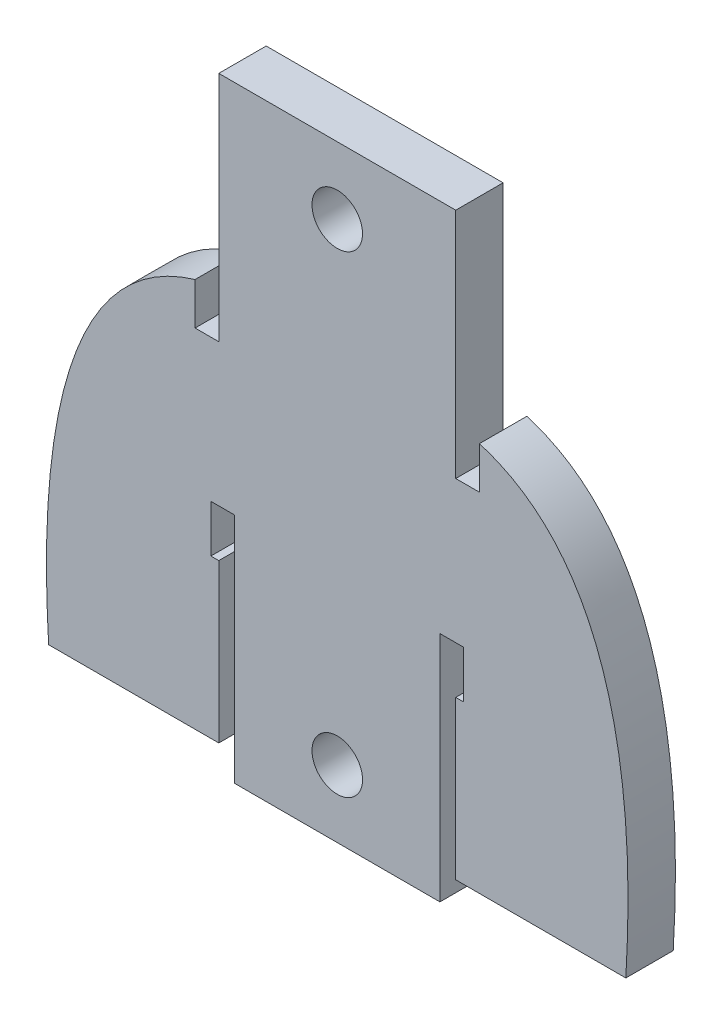
ISO-10303-21;
HEADER;
FILE_DESCRIPTION(('STEP AP214'),'2;1');
FILE_NAME('part.step','',(''),(''),'','','');
FILE_SCHEMA(('AUTOMOTIVE_DESIGN { 1 0 10303 214 1 1 1 1 }'));
ENDSEC;
DATA;
#1=APPLICATION_CONTEXT('core data for automotive mechanical design processes');
#2=APPLICATION_PROTOCOL_DEFINITION('international standard','automotive_design',2000,#1);
#3=PRODUCT_CONTEXT('',#1,'mechanical');
#4=PRODUCT('Part','Part','',(#3));
#5=PRODUCT_RELATED_PRODUCT_CATEGORY('part','',(#4));
#6=PRODUCT_DEFINITION_FORMATION('','',#4);
#7=PRODUCT_DEFINITION_CONTEXT('part definition',#1,'design');
#8=PRODUCT_DEFINITION('design','',#6,#7);
#9=PRODUCT_DEFINITION_SHAPE('','',#8);
#10=(LENGTH_UNIT() NAMED_UNIT(*) SI_UNIT(.MILLI.,.METRE.));
#11=(NAMED_UNIT(*) PLANE_ANGLE_UNIT() SI_UNIT($,.RADIAN.));
#12=(NAMED_UNIT(*) SI_UNIT($,.STERADIAN.) SOLID_ANGLE_UNIT());
#13=UNCERTAINTY_MEASURE_WITH_UNIT(LENGTH_MEASURE(1.E-05),#10,'distance_accuracy_value','');
#14=(GEOMETRIC_REPRESENTATION_CONTEXT(3) GLOBAL_UNCERTAINTY_ASSIGNED_CONTEXT((#13)) GLOBAL_UNIT_ASSIGNED_CONTEXT((#10,
#11,#12)) REPRESENTATION_CONTEXT('',''));
#15=CARTESIAN_POINT('',(0.,0.,0.));
#16=DIRECTION('',(0.,0.,1.));
#17=DIRECTION('',(1.,0.,0.));
#18=AXIS2_PLACEMENT_3D('',#15,#16,#17);
#19=CARTESIAN_POINT('',(24.726999090185,4.8045723425981,-3.));
#20=DIRECTION('',(0.,0.,-1.));
#21=DIRECTION('',(-1.,0.,0.));
#22=AXIS2_PLACEMENT_3D('',#19,#20,#21);
#23=PLANE('',#22);
#24=DIRECTION('',(0.,1.,0.));
#25=VECTOR('',#24,1.);
#26=CARTESIAN_POINT('',(-0.5,0.,-3.));
#27=LINE('',#26,#25);
#28=CARTESIAN_POINT('',(-0.5,0.,-3.));
#29=VERTEX_POINT('',#28);
#30=CARTESIAN_POINT('',(-0.5,3.,-3.));
#31=VERTEX_POINT('',#30);
#32=EDGE_CURVE('E56',#29,#31,#27,.T.);
#33=ORIENTED_EDGE('',*,*,#32,.F.);
#34=DIRECTION('',(-1.,0.,0.));
#35=VECTOR('',#34,1.);
#36=CARTESIAN_POINT('',(0.999999999999997,0.,-3.));
#37=LINE('',#36,#35);
#38=CARTESIAN_POINT('',(0.,0.,-3.));
#39=VERTEX_POINT('',#38);
#40=EDGE_CURVE('E236',#39,#29,#37,.T.);
#41=ORIENTED_EDGE('',*,*,#40,.F.);
#42=DIRECTION('',(0.,1.,0.));
#43=VECTOR('',#42,1.);
#44=CARTESIAN_POINT('',(0.,-10.,-3.));
#45=LINE('',#44,#43);
#46=CARTESIAN_POINT('',(0.,-10.,-3.));
#47=VERTEX_POINT('',#46);
#48=EDGE_CURVE('E395',#47,#39,#45,.T.);
#49=ORIENTED_EDGE('',*,*,#48,.F.);
#50=DIRECTION('',(1.,0.,0.));
#51=VECTOR('',#50,1.);
#52=CARTESIAN_POINT('',(0.,-10.,-3.));
#53=LINE('',#52,#51);
#54=CARTESIAN_POINT('',(-10.769213986079,-10.,-3.));
#55=VERTEX_POINT('',#54);
#56=EDGE_CURVE('E433',#55,#47,#53,.T.);
#57=ORIENTED_EDGE('',*,*,#56,.F.);
#58=CARTESIAN_POINT('',(0.,15.,-3.));
#59=CARTESIAN_POINT('',(-11.1028341379482,13.2297666244831,-3.));
#60=CARTESIAN_POINT('',(-11.2460921071856,-2.08424037755486,-3.));
#61=CARTESIAN_POINT('',(-10.769213986079,-10.,-3.));
#62=B_SPLINE_CURVE_WITH_KNOTS('',3,(#58,#59,#60,#61),.UNSPECIFIED.,.F.,.F.,(4,4),(0.,1.),.UNSPECIFIED.);
#63=CARTESIAN_POINT('',(-1.50000001798802,14.6610170054647,-3.));
#64=VERTEX_POINT('',#63);
#65=EDGE_CURVE('E317',#64,#55,#62,.T.);
#66=ORIENTED_EDGE('',*,*,#65,.F.);
#67=DIRECTION('',(-3.37991384558532E-09,1.,0.));
#68=VECTOR('',#67,1.);
#69=CARTESIAN_POINT('',(-1.5,12.,-3.));
#70=LINE('',#69,#68);
#71=CARTESIAN_POINT('',(-1.5,12.,-3.));
#72=VERTEX_POINT('',#71);
#73=EDGE_CURVE('E290',#72,#64,#70,.T.);
#74=ORIENTED_EDGE('',*,*,#73,.F.);
#75=DIRECTION('',(-1.,0.,0.));
#76=VECTOR('',#75,1.);
#77=CARTESIAN_POINT('',(0.,12.,-3.));
#78=LINE('',#77,#76);
#79=CARTESIAN_POINT('',(0.,12.,-3.));
#80=VERTEX_POINT('',#79);
#81=EDGE_CURVE('E286',#80,#72,#78,.T.);
#82=ORIENTED_EDGE('',*,*,#81,.F.);
#83=DIRECTION('',(0.,-1.,0.));
#84=VECTOR('',#83,1.);
#85=CARTESIAN_POINT('',(0.,13.5,-3.));
#86=LINE('',#85,#84);
#87=CARTESIAN_POINT('',(0.,26.7123889803847,-2.99999999999994));
#88=VERTEX_POINT('',#87);
#89=EDGE_CURVE('E213',#88,#80,#86,.T.);
#90=ORIENTED_EDGE('',*,*,#89,.F.);
#91=DIRECTION('',(-1.,0.,0.));
#92=VECTOR('',#91,1.);
#93=CARTESIAN_POINT('',(0.,26.7123889803847,-2.99999999999994));
#94=LINE('',#93,#92);
#95=CARTESIAN_POINT('',(15.,26.7123889803847,-2.99999999999994));
#96=VERTEX_POINT('',#95);
#97=EDGE_CURVE('E205',#96,#88,#94,.T.);
#98=ORIENTED_EDGE('',*,*,#97,.F.);
#99=DIRECTION('',(0.,1.,0.));
#100=VECTOR('',#99,1.);
#101=CARTESIAN_POINT('',(15.,12.,-3.));
#102=LINE('',#101,#100);
#103=CARTESIAN_POINT('',(15.,12.,-3.));
#104=VERTEX_POINT('',#103);
#105=EDGE_CURVE('E189',#104,#96,#102,.T.);
#106=ORIENTED_EDGE('',*,*,#105,.F.);
#107=DIRECTION('',(-1.,0.,0.));
#108=VECTOR('',#107,1.);
#109=CARTESIAN_POINT('',(16.5,12.,-3.));
#110=LINE('',#109,#108);
#111=CARTESIAN_POINT('',(16.5,12.,-3.));
#112=VERTEX_POINT('',#111);
#113=EDGE_CURVE('E283',#112,#104,#110,.T.);
#114=ORIENTED_EDGE('',*,*,#113,.F.);
#115=DIRECTION('',(-3.37991596426825E-09,-1.,0.));
#116=VECTOR('',#115,1.);
#117=CARTESIAN_POINT('',(16.500000008994,14.6610170081404,-3.));
#118=LINE('',#117,#116);
#119=CARTESIAN_POINT('',(16.500000017988,14.6610170054647,-3.));
#120=VERTEX_POINT('',#119);
#121=EDGE_CURVE('E278',#120,#112,#118,.T.);
#122=ORIENTED_EDGE('',*,*,#121,.F.);
#123=CARTESIAN_POINT('',(25.769213986079,-10.,-3.));
#124=CARTESIAN_POINT('',(26.2460921071856,-2.08424037755486,-3.));
#125=CARTESIAN_POINT('',(26.1028341379482,13.2297666244831,-3.));
#126=CARTESIAN_POINT('',(15.,15.,-3.));
#127=B_SPLINE_CURVE_WITH_KNOTS('',3,(#123,#124,#125,#126),.UNSPECIFIED.,.F.,.F.,(4,4),(0.,1.),.UNSPECIFIED.);
#128=CARTESIAN_POINT('',(25.769213986079,-10.,-3.));
#129=VERTEX_POINT('',#128);
#130=EDGE_CURVE('E311',#129,#120,#127,.T.);
#131=ORIENTED_EDGE('',*,*,#130,.F.);
#132=DIRECTION('',(1.,0.,0.));
#133=VECTOR('',#132,1.);
#134=CARTESIAN_POINT('',(15.,-10.,-3.));
#135=LINE('',#134,#133);
#136=CARTESIAN_POINT('',(15.,-10.,-3.));
#137=VERTEX_POINT('',#136);
#138=EDGE_CURVE('E307',#137,#129,#135,.T.);
#139=ORIENTED_EDGE('',*,*,#138,.F.);
#140=DIRECTION('',(0.,-1.,0.));
#141=VECTOR('',#140,1.);
#142=CARTESIAN_POINT('',(15.,0.,-3.));
#143=LINE('',#142,#141);
#144=CARTESIAN_POINT('',(15.,0.,-3.));
#145=VERTEX_POINT('',#144);
#146=EDGE_CURVE('E304',#145,#137,#143,.T.);
#147=ORIENTED_EDGE('',*,*,#146,.F.);
#148=DIRECTION('',(-1.,0.,0.));
#149=VECTOR('',#148,1.);
#150=CARTESIAN_POINT('',(15.5,0.,-3.));
#151=LINE('',#150,#149);
#152=CARTESIAN_POINT('',(15.5,0.,-3.));
#153=VERTEX_POINT('',#152);
#154=EDGE_CURVE('E257',#153,#145,#151,.T.);
#155=ORIENTED_EDGE('',*,*,#154,.F.);
#156=DIRECTION('',(0.,-1.,0.));
#157=VECTOR('',#156,1.);
#158=CARTESIAN_POINT('',(15.5,3.,-3.));
#159=LINE('',#158,#157);
#160=CARTESIAN_POINT('',(15.5,3.,-3.));
#161=VERTEX_POINT('',#160);
#162=EDGE_CURVE('E253',#161,#153,#159,.T.);
#163=ORIENTED_EDGE('',*,*,#162,.F.);
#164=DIRECTION('',(1.,0.,0.));
#165=VECTOR('',#164,1.);
#166=CARTESIAN_POINT('',(14.,3.,-3.));
#167=LINE('',#166,#165);
#168=CARTESIAN_POINT('',(14.,3.,-3.));
#169=VERTEX_POINT('',#168);
#170=EDGE_CURVE('E249',#169,#161,#167,.T.);
#171=ORIENTED_EDGE('',*,*,#170,.F.);
#172=DIRECTION('',(0.,1.,0.));
#173=VECTOR('',#172,1.);
#174=CARTESIAN_POINT('',(14.,1.5,-3.));
#175=LINE('',#174,#173);
#176=CARTESIAN_POINT('',(14.,-11.7123889803847,-2.99999999999994));
#177=VERTEX_POINT('',#176);
#178=EDGE_CURVE('E246',#177,#169,#175,.T.);
#179=ORIENTED_EDGE('',*,*,#178,.F.);
#180=DIRECTION('',(1.,0.,0.));
#181=VECTOR('',#180,1.);
#182=CARTESIAN_POINT('',(14.,-11.7123889803847,-2.99999999999994));
#183=LINE('',#182,#181);
#184=CARTESIAN_POINT('',(1.,-11.7123889803847,-2.99999999999994));
#185=VERTEX_POINT('',#184);
#186=EDGE_CURVE('E233',#185,#177,#183,.T.);
#187=ORIENTED_EDGE('',*,*,#186,.F.);
#188=DIRECTION('',(0.,-1.,0.));
#189=VECTOR('',#188,1.);
#190=CARTESIAN_POINT('',(1.,3.,-3.));
#191=LINE('',#190,#189);
#192=CARTESIAN_POINT('',(1.,3.,-3.));
#193=VERTEX_POINT('',#192);
#194=EDGE_CURVE('E243',#193,#185,#191,.T.);
#195=ORIENTED_EDGE('',*,*,#194,.F.);
#196=DIRECTION('',(1.,0.,0.));
#197=VECTOR('',#196,1.);
#198=CARTESIAN_POINT('',(-0.5,3.,-3.));
#199=LINE('',#198,#197);
#200=EDGE_CURVE('E61',#31,#193,#199,.T.);
#201=ORIENTED_EDGE('',*,*,#200,.F.);
#202=EDGE_LOOP('',(#33,#41,#49,#57,#66,#74,#82,#90,#98,#106,#114,#122,#131,#139,#147,#155,#163,
#171,#179,#187,#195,#201));
#203=FACE_BOUND('',#202,.T.);
#204=CARTESIAN_POINT('',(7.5,-7.46238898038476,-2.99999999999997));
#205=DIRECTION('',(0.,0.,-1.));
#206=DIRECTION('',(0.,1.,0.));
#207=AXIS2_PLACEMENT_3D('',#204,#205,#206);
#208=CIRCLE('',#207,1.6);
#209=CARTESIAN_POINT('',(7.5,-5.86238898038476,-2.99999999999998));
#210=VERTEX_POINT('',#209);
#211=EDGE_CURVE('E227',#210,#210,#208,.T.);
#212=ORIENTED_EDGE('',*,*,#211,.F.);
#213=EDGE_LOOP('',(#212));
#214=FACE_BOUND('',#213,.T.);
#215=CARTESIAN_POINT('',(7.5,22.4623889803847,-2.99999999999997));
#216=DIRECTION('',(0.,0.,-1.));
#217=DIRECTION('',(0.,1.,0.));
#218=AXIS2_PLACEMENT_3D('',#215,#216,#217);
#219=CIRCLE('',#218,1.6);
#220=CARTESIAN_POINT('',(7.5,24.0623889803847,-2.99999999999996));
#221=VERTEX_POINT('',#220);
#222=EDGE_CURVE('E209',#221,#221,#219,.T.);
#223=ORIENTED_EDGE('',*,*,#222,.F.);
#224=EDGE_LOOP('',(#223));
#225=FACE_BOUND('',#224,.T.);
#226=ADVANCED_FACE('F41',(#203,#214,#225),#23,.T.);
#227=CARTESIAN_POINT('',(24.726999090185,4.8045723425981,0.));
#228=DIRECTION('',(0.,0.,-1.));
#229=DIRECTION('',(-1.,0.,0.));
#230=AXIS2_PLACEMENT_3D('',#227,#228,#229);
#231=PLANE('',#230);
#232=DIRECTION('',(1.,0.,0.));
#233=VECTOR('',#232,1.);
#234=CARTESIAN_POINT('',(24.726999090185,0.,0.));
#235=LINE('',#234,#233);
#236=CARTESIAN_POINT('',(-0.5,0.,0.));
#237=VERTEX_POINT('',#236);
#238=CARTESIAN_POINT('',(0.,0.,0.));
#239=VERTEX_POINT('',#238);
#240=EDGE_CURVE('E274',#237,#239,#235,.T.);
#241=ORIENTED_EDGE('',*,*,#240,.F.);
#242=DIRECTION('',(0.,-1.,0.));
#243=VECTOR('',#242,1.);
#244=CARTESIAN_POINT('',(-0.5,4.8045723425981,0.));
#245=LINE('',#244,#243);
#246=CARTESIAN_POINT('',(-0.5,3.,0.));
#247=VERTEX_POINT('',#246);
#248=EDGE_CURVE('E12',#247,#237,#245,.T.);
#249=ORIENTED_EDGE('',*,*,#248,.F.);
#250=DIRECTION('',(-1.,0.,0.));
#251=VECTOR('',#250,1.);
#252=CARTESIAN_POINT('',(24.726999090185,3.,0.));
#253=LINE('',#252,#251);
#254=CARTESIAN_POINT('',(1.,3.,0.));
#255=VERTEX_POINT('',#254);
#256=EDGE_CURVE('E49',#255,#247,#253,.T.);
#257=ORIENTED_EDGE('',*,*,#256,.F.);
#258=DIRECTION('',(0.,1.,0.));
#259=VECTOR('',#258,1.);
#260=CARTESIAN_POINT('',(1.,4.8045723425981,0.));
#261=LINE('',#260,#259);
#262=CARTESIAN_POINT('',(1.,-11.7123889803847,0.));
#263=VERTEX_POINT('',#262);
#264=EDGE_CURVE('E419',#263,#255,#261,.T.);
#265=ORIENTED_EDGE('',*,*,#264,.F.);
#266=DIRECTION('',(1.,0.,0.));
#267=VECTOR('',#266,1.);
#268=CARTESIAN_POINT('',(14.,-11.7123889803847,0.));
#269=LINE('',#268,#267);
#270=CARTESIAN_POINT('',(14.,-11.7123889803847,0.));
#271=VERTEX_POINT('',#270);
#272=EDGE_CURVE('E217',#263,#271,#269,.T.);
#273=ORIENTED_EDGE('',*,*,#272,.T.);
#274=DIRECTION('',(0.,-1.,0.));
#275=VECTOR('',#274,1.);
#276=CARTESIAN_POINT('',(14.,4.8045723425981,0.));
#277=LINE('',#276,#275);
#278=CARTESIAN_POINT('',(14.,3.,0.));
#279=VERTEX_POINT('',#278);
#280=EDGE_CURVE('E417',#279,#271,#277,.T.);
#281=ORIENTED_EDGE('',*,*,#280,.F.);
#282=DIRECTION('',(-1.,0.,0.));
#283=VECTOR('',#282,1.);
#284=CARTESIAN_POINT('',(24.726999090185,3.,0.));
#285=LINE('',#284,#283);
#286=CARTESIAN_POINT('',(15.5,3.,0.));
#287=VERTEX_POINT('',#286);
#288=EDGE_CURVE('E414',#287,#279,#285,.T.);
#289=ORIENTED_EDGE('',*,*,#288,.F.);
#290=DIRECTION('',(0.,1.,0.));
#291=VECTOR('',#290,1.);
#292=CARTESIAN_POINT('',(15.5,4.8045723425981,0.));
#293=LINE('',#292,#291);
#294=CARTESIAN_POINT('',(15.5,0.,0.));
#295=VERTEX_POINT('',#294);
#296=EDGE_CURVE('E411',#295,#287,#293,.T.);
#297=ORIENTED_EDGE('',*,*,#296,.F.);
#298=DIRECTION('',(1.,0.,0.));
#299=VECTOR('',#298,1.);
#300=CARTESIAN_POINT('',(24.726999090185,0.,0.));
#301=LINE('',#300,#299);
#302=CARTESIAN_POINT('',(15.,0.,0.));
#303=VERTEX_POINT('',#302);
#304=EDGE_CURVE('E238',#303,#295,#301,.T.);
#305=ORIENTED_EDGE('',*,*,#304,.F.);
#306=DIRECTION('',(0.,-1.,0.));
#307=VECTOR('',#306,1.);
#308=CARTESIAN_POINT('',(15.,0.,0.));
#309=LINE('',#308,#307);
#310=CARTESIAN_POINT('',(15.,-10.,0.));
#311=VERTEX_POINT('',#310);
#312=EDGE_CURVE('E281',#303,#311,#309,.T.);
#313=ORIENTED_EDGE('',*,*,#312,.T.);
#314=DIRECTION('',(1.,0.,0.));
#315=VECTOR('',#314,1.);
#316=CARTESIAN_POINT('',(15.,-10.,0.));
#317=LINE('',#316,#315);
#318=CARTESIAN_POINT('',(25.769213986079,-10.,0.));
#319=VERTEX_POINT('',#318);
#320=EDGE_CURVE('E438',#311,#319,#317,.T.);
#321=ORIENTED_EDGE('',*,*,#320,.T.);
#322=CARTESIAN_POINT('',(25.769213986079,-10.,0.));
#323=CARTESIAN_POINT('',(26.2460921071856,-2.08424037755486,0.));
#324=CARTESIAN_POINT('',(26.1028341379482,13.2297666244831,0.));
#325=CARTESIAN_POINT('',(15.,15.,0.));
#326=B_SPLINE_CURVE_WITH_KNOTS('',3,(#322,#323,#324,#325),.UNSPECIFIED.,.F.,.F.,(4,4),(0.,1.),.UNSPECIFIED.);
#327=CARTESIAN_POINT('',(16.500000017988,14.6610170054647,0.));
#328=VERTEX_POINT('',#327);
#329=EDGE_CURVE('E377',#319,#328,#326,.T.);
#330=ORIENTED_EDGE('',*,*,#329,.T.);
#331=DIRECTION('',(3.37991596426825E-09,1.,0.));
#332=VECTOR('',#331,1.);
#333=CARTESIAN_POINT('',(16.4999999756801,4.80457237040467,0.));
#334=LINE('',#333,#332);
#335=CARTESIAN_POINT('',(16.5,12.,0.));
#336=VERTEX_POINT('',#335);
#337=EDGE_CURVE('E408',#336,#328,#334,.T.);
#338=ORIENTED_EDGE('',*,*,#337,.F.);
#339=DIRECTION('',(1.,0.,0.));
#340=VECTOR('',#339,1.);
#341=CARTESIAN_POINT('',(24.726999090185,12.,0.));
#342=LINE('',#341,#340);
#343=CARTESIAN_POINT('',(15.,12.,0.));
#344=VERTEX_POINT('',#343);
#345=EDGE_CURVE('E405',#344,#336,#342,.T.);
#346=ORIENTED_EDGE('',*,*,#345,.F.);
#347=DIRECTION('',(0.,-1.,0.));
#348=VECTOR('',#347,1.);
#349=CARTESIAN_POINT('',(15.,4.8045723425981,0.));
#350=LINE('',#349,#348);
#351=CARTESIAN_POINT('',(15.,26.7123889803847,0.));
#352=VERTEX_POINT('',#351);
#353=EDGE_CURVE('E403',#352,#344,#350,.T.);
#354=ORIENTED_EDGE('',*,*,#353,.F.);
#355=DIRECTION('',(-1.,0.,0.));
#356=VECTOR('',#355,1.);
#357=CARTESIAN_POINT('',(0.,26.7123889803847,0.));
#358=LINE('',#357,#356);
#359=CARTESIAN_POINT('',(0.,26.7123889803847,0.));
#360=VERTEX_POINT('',#359);
#361=EDGE_CURVE('E208',#352,#360,#358,.T.);
#362=ORIENTED_EDGE('',*,*,#361,.T.);
#363=DIRECTION('',(0.,1.,0.));
#364=VECTOR('',#363,1.);
#365=CARTESIAN_POINT('',(0.,4.8045723425981,0.));
#366=LINE('',#365,#364);
#367=CARTESIAN_POINT('',(0.,12.,0.));
#368=VERTEX_POINT('',#367);
#369=EDGE_CURVE('E401',#368,#360,#366,.T.);
#370=ORIENTED_EDGE('',*,*,#369,.F.);
#371=DIRECTION('',(1.,0.,0.));
#372=VECTOR('',#371,1.);
#373=CARTESIAN_POINT('',(24.726999090185,12.,0.));
#374=LINE('',#373,#372);
#375=CARTESIAN_POINT('',(-1.5,12.,0.));
#376=VERTEX_POINT('',#375);
#377=EDGE_CURVE('E398',#376,#368,#374,.T.);
#378=ORIENTED_EDGE('',*,*,#377,.F.);
#379=DIRECTION('',(3.37991384558532E-09,-1.,0.));
#380=VECTOR('',#379,1.);
#381=CARTESIAN_POINT('',(-1.49999997568008,4.8045722539531,0.));
#382=LINE('',#381,#380);
#383=CARTESIAN_POINT('',(-1.50000001798802,14.6610170054647,0.));
#384=VERTEX_POINT('',#383);
#385=EDGE_CURVE('E385',#384,#376,#382,.T.);
#386=ORIENTED_EDGE('',*,*,#385,.F.);
#387=CARTESIAN_POINT('',(0.,15.,0.));
#388=CARTESIAN_POINT('',(-11.1028341379482,13.2297666244831,0.));
#389=CARTESIAN_POINT('',(-11.2460921071856,-2.08424037755486,0.));
#390=CARTESIAN_POINT('',(-10.769213986079,-10.,0.));
#391=B_SPLINE_CURVE_WITH_KNOTS('',3,(#387,#388,#389,#390),.UNSPECIFIED.,.F.,.F.,(4,4),(0.,1.),.UNSPECIFIED.);
#392=CARTESIAN_POINT('',(-10.769213986079,-10.,0.));
#393=VERTEX_POINT('',#392);
#394=EDGE_CURVE('E374',#384,#393,#391,.T.);
#395=ORIENTED_EDGE('',*,*,#394,.T.);
#396=DIRECTION('',(1.,0.,0.));
#397=VECTOR('',#396,1.);
#398=CARTESIAN_POINT('',(0.,-10.,0.));
#399=LINE('',#398,#397);
#400=CARTESIAN_POINT('',(0.,-10.,0.));
#401=VERTEX_POINT('',#400);
#402=EDGE_CURVE('E366',#393,#401,#399,.T.);
#403=ORIENTED_EDGE('',*,*,#402,.T.);
#404=DIRECTION('',(0.,1.,0.));
#405=VECTOR('',#404,1.);
#406=CARTESIAN_POINT('',(0.,-10.,0.));
#407=LINE('',#406,#405);
#408=EDGE_CURVE('E308',#401,#239,#407,.T.);
#409=ORIENTED_EDGE('',*,*,#408,.T.);
#410=EDGE_LOOP('',(#241,#249,#257,#265,#273,#281,#289,#297,#305,#313,#321,#330,#338,#346,#354,
#362,#370,#378,#386,#395,#403,#409));
#411=FACE_BOUND('',#410,.T.);
#412=CARTESIAN_POINT('',(7.5,-7.46238898038476,0.));
#413=DIRECTION('',(0.,0.,-1.));
#414=DIRECTION('',(0.,1.,0.));
#415=AXIS2_PLACEMENT_3D('',#412,#413,#414);
#416=CIRCLE('',#415,1.6);
#417=CARTESIAN_POINT('',(7.5,-5.86238898038476,0.));
#418=VERTEX_POINT('',#417);
#419=EDGE_CURVE('E221',#418,#418,#416,.T.);
#420=ORIENTED_EDGE('',*,*,#419,.T.);
#421=EDGE_LOOP('',(#420));
#422=FACE_BOUND('',#421,.T.);
#423=CARTESIAN_POINT('',(7.5,22.4623889803847,0.));
#424=DIRECTION('',(0.,0.,1.));
#425=DIRECTION('',(0.,-1.,0.));
#426=AXIS2_PLACEMENT_3D('',#423,#424,#425);
#427=CIRCLE('',#426,1.6);
#428=CARTESIAN_POINT('',(7.5,20.8623889803847,0.));
#429=VERTEX_POINT('',#428);
#430=EDGE_CURVE('E455',#429,#429,#427,.T.);
#431=ORIENTED_EDGE('',*,*,#430,.F.);
#432=EDGE_LOOP('',(#431));
#433=FACE_BOUND('',#432,.T.);
#434=ADVANCED_FACE('F43',(#411,#422,#433),#231,.F.);
#435=DIRECTION('',(0.,0.,1.));
#436=VECTOR('',#435,1.);
#437=SURFACE_OF_LINEAR_EXTRUSION('',#62,#436);
#438=ORIENTED_EDGE('',*,*,#394,.F.);
#439=DIRECTION('',(0.,0.,1.));
#440=VECTOR('',#439,1.);
#441=CARTESIAN_POINT('',(-1.50000000899401,14.6610170081404,-3.));
#442=LINE('',#441,#440);
#443=EDGE_CURVE('E293',#64,#384,#442,.T.);
#444=ORIENTED_EDGE('',*,*,#443,.F.);
#445=ORIENTED_EDGE('',*,*,#65,.T.);
#446=DIRECTION('',(0.,0.,1.));
#447=VECTOR('',#446,1.);
#448=CARTESIAN_POINT('',(-10.769213986079,-10.,-3.));
#449=LINE('',#448,#447);
#450=EDGE_CURVE('E369',#55,#393,#449,.T.);
#451=ORIENTED_EDGE('',*,*,#450,.T.);
#452=EDGE_LOOP('',(#438,#444,#445,#451));
#453=FACE_BOUND('',#452,.T.);
#454=ADVANCED_FACE('F331',(#453),#437,.T.);
#455=DIRECTION('',(0.,0.,1.));
#456=VECTOR('',#455,1.);
#457=SURFACE_OF_LINEAR_EXTRUSION('',#127,#456);
#458=ORIENTED_EDGE('',*,*,#130,.T.);
#459=DIRECTION('',(0.,0.,1.));
#460=VECTOR('',#459,1.);
#461=CARTESIAN_POINT('',(16.500000008994,14.6610170081404,-3.));
#462=LINE('',#461,#460);
#463=EDGE_CURVE('E282',#120,#328,#462,.T.);
#464=ORIENTED_EDGE('',*,*,#463,.T.);
#465=ORIENTED_EDGE('',*,*,#329,.F.);
#466=DIRECTION('',(0.,0.,1.));
#467=VECTOR('',#466,1.);
#468=CARTESIAN_POINT('',(25.769213986079,-10.,-3.));
#469=LINE('',#468,#467);
#470=EDGE_CURVE('E388',#129,#319,#469,.T.);
#471=ORIENTED_EDGE('',*,*,#470,.F.);
#472=EDGE_LOOP('',(#458,#464,#465,#471));
#473=FACE_BOUND('',#472,.T.);
#474=ADVANCED_FACE('F326',(#473),#457,.T.);
#475=CARTESIAN_POINT('',(0.,-10.,-3.));
#476=DIRECTION('',(1.,0.,0.));
#477=DIRECTION('',(0.,0.,-1.));
#478=AXIS2_PLACEMENT_3D('',#475,#476,#477);
#479=PLANE('',#478);
#480=ORIENTED_EDGE('',*,*,#408,.F.);
#481=DIRECTION('',(0.,0.,1.));
#482=VECTOR('',#481,1.);
#483=CARTESIAN_POINT('',(0.,-10.,-3.));
#484=LINE('',#483,#482);
#485=EDGE_CURVE('E371',#47,#401,#484,.T.);
#486=ORIENTED_EDGE('',*,*,#485,.F.);
#487=ORIENTED_EDGE('',*,*,#48,.T.);
#488=DIRECTION('',(0.,0.,1.));
#489=VECTOR('',#488,1.);
#490=CARTESIAN_POINT('',(0.,0.,-3.));
#491=LINE('',#490,#489);
#492=EDGE_CURVE('E383',#39,#239,#491,.T.);
#493=ORIENTED_EDGE('',*,*,#492,.T.);
#494=EDGE_LOOP('',(#480,#486,#487,#493));
#495=FACE_BOUND('',#494,.T.);
#496=ADVANCED_FACE('F330',(#495),#479,.T.);
#497=CARTESIAN_POINT('',(0.,-10.,-3.));
#498=DIRECTION('',(0.,-1.,0.));
#499=DIRECTION('',(1.,0.,0.));
#500=AXIS2_PLACEMENT_3D('',#497,#498,#499);
#501=PLANE('',#500);
#502=ORIENTED_EDGE('',*,*,#402,.F.);
#503=ORIENTED_EDGE('',*,*,#450,.F.);
#504=ORIENTED_EDGE('',*,*,#56,.T.);
#505=ORIENTED_EDGE('',*,*,#485,.T.);
#506=EDGE_LOOP('',(#502,#503,#504,#505));
#507=FACE_BOUND('',#506,.T.);
#508=ADVANCED_FACE('F337',(#507),#501,.T.);
#509=CARTESIAN_POINT('',(15.,-10.,-3.));
#510=DIRECTION('',(0.,-1.,0.));
#511=DIRECTION('',(1.,0.,0.));
#512=AXIS2_PLACEMENT_3D('',#509,#510,#511);
#513=PLANE('',#512);
#514=ORIENTED_EDGE('',*,*,#320,.F.);
#515=DIRECTION('',(0.,0.,1.));
#516=VECTOR('',#515,1.);
#517=CARTESIAN_POINT('',(15.,-10.,-3.));
#518=LINE('',#517,#516);
#519=EDGE_CURVE('E390',#137,#311,#518,.T.);
#520=ORIENTED_EDGE('',*,*,#519,.F.);
#521=ORIENTED_EDGE('',*,*,#138,.T.);
#522=ORIENTED_EDGE('',*,*,#470,.T.);
#523=EDGE_LOOP('',(#514,#520,#521,#522));
#524=FACE_BOUND('',#523,.T.);
#525=ADVANCED_FACE('F334',(#524),#513,.T.);
#526=CARTESIAN_POINT('',(15.,0.,-3.));
#527=DIRECTION('',(-1.,0.,0.));
#528=DIRECTION('',(0.,-1.,0.));
#529=AXIS2_PLACEMENT_3D('',#526,#527,#528);
#530=PLANE('',#529);
#531=ORIENTED_EDGE('',*,*,#312,.F.);
#532=DIRECTION('',(0.,0.,1.));
#533=VECTOR('',#532,1.);
#534=CARTESIAN_POINT('',(15.,0.,-3.));
#535=LINE('',#534,#533);
#536=EDGE_CURVE('E392',#145,#303,#535,.T.);
#537=ORIENTED_EDGE('',*,*,#536,.F.);
#538=ORIENTED_EDGE('',*,*,#146,.T.);
#539=ORIENTED_EDGE('',*,*,#519,.T.);
#540=EDGE_LOOP('',(#531,#537,#538,#539));
#541=FACE_BOUND('',#540,.T.);
#542=ADVANCED_FACE('F336',(#541),#530,.T.);
#543=CARTESIAN_POINT('',(16.500000008994,14.6610170081404,-3.));
#544=DIRECTION('',(-1.,3.37991596426825E-09,0.));
#545=DIRECTION('',(-3.37991596426825E-09,-1.,0.));
#546=AXIS2_PLACEMENT_3D('',#543,#544,#545);
#547=PLANE('',#546);
#548=DIRECTION('',(0.,0.,1.));
#549=VECTOR('',#548,1.);
#550=CARTESIAN_POINT('',(16.5,12.,-3.));
#551=LINE('',#550,#549);
#552=EDGE_CURVE('E199',#112,#336,#551,.T.);
#553=ORIENTED_EDGE('',*,*,#552,.T.);
#554=ORIENTED_EDGE('',*,*,#337,.T.);
#555=ORIENTED_EDGE('',*,*,#463,.F.);
#556=ORIENTED_EDGE('',*,*,#121,.T.);
#557=EDGE_LOOP('',(#553,#554,#555,#556));
#558=FACE_BOUND('',#557,.T.);
#559=ADVANCED_FACE('F340',(#558),#547,.T.);
#560=CARTESIAN_POINT('',(16.5,12.,-3.));
#561=DIRECTION('',(0.,1.,0.));
#562=DIRECTION('',(0.,0.,1.));
#563=AXIS2_PLACEMENT_3D('',#560,#561,#562);
#564=PLANE('',#563);
#565=DIRECTION('',(0.,0.,1.));
#566=VECTOR('',#565,1.);
#567=CARTESIAN_POINT('',(15.,12.,-3.));
#568=LINE('',#567,#566);
#569=EDGE_CURVE('E196',#104,#344,#568,.T.);
#570=ORIENTED_EDGE('',*,*,#569,.T.);
#571=ORIENTED_EDGE('',*,*,#345,.T.);
#572=ORIENTED_EDGE('',*,*,#552,.F.);
#573=ORIENTED_EDGE('',*,*,#113,.T.);
#574=EDGE_LOOP('',(#570,#571,#572,#573));
#575=FACE_BOUND('',#574,.T.);
#576=ADVANCED_FACE('F345',(#575),#564,.T.);
#577=CARTESIAN_POINT('',(15.,12.,-3.));
#578=DIRECTION('',(1.,0.,0.));
#579=DIRECTION('',(0.,0.,-1.));
#580=AXIS2_PLACEMENT_3D('',#577,#578,#579);
#581=PLANE('',#580);
#582=ORIENTED_EDGE('',*,*,#105,.T.);
#583=DIRECTION('',(0.,0.,-1.));
#584=VECTOR('',#583,1.);
#585=CARTESIAN_POINT('',(15.,26.7123889803847,0.));
#586=LINE('',#585,#584);
#587=EDGE_CURVE('E193',#352,#96,#586,.T.);
#588=ORIENTED_EDGE('',*,*,#587,.F.);
#589=ORIENTED_EDGE('',*,*,#353,.T.);
#590=ORIENTED_EDGE('',*,*,#569,.F.);
#591=EDGE_LOOP('',(#582,#588,#589,#590));
#592=FACE_BOUND('',#591,.T.);
#593=ADVANCED_FACE('F191',(#592),#581,.T.);
#594=CARTESIAN_POINT('',(0.,13.5,-3.));
#595=DIRECTION('',(-1.,0.,0.));
#596=DIRECTION('',(0.,0.,1.));
#597=AXIS2_PLACEMENT_3D('',#594,#595,#596);
#598=PLANE('',#597);
#599=DIRECTION('',(0.,0.,1.));
#600=VECTOR('',#599,1.);
#601=CARTESIAN_POINT('',(0.,12.,-3.));
#602=LINE('',#601,#600);
#603=EDGE_CURVE('E289',#80,#368,#602,.T.);
#604=ORIENTED_EDGE('',*,*,#603,.T.);
#605=ORIENTED_EDGE('',*,*,#369,.T.);
#606=DIRECTION('',(0.,0.,-1.));
#607=VECTOR('',#606,1.);
#608=CARTESIAN_POINT('',(0.,26.7123889803847,0.));
#609=LINE('',#608,#607);
#610=EDGE_CURVE('E452',#360,#88,#609,.T.);
#611=ORIENTED_EDGE('',*,*,#610,.T.);
#612=ORIENTED_EDGE('',*,*,#89,.T.);
#613=EDGE_LOOP('',(#604,#605,#611,#612));
#614=FACE_BOUND('',#613,.T.);
#615=ADVANCED_FACE('F514',(#614),#598,.T.);
#616=CARTESIAN_POINT('',(0.,12.,-3.));
#617=DIRECTION('',(0.,1.,0.));
#618=DIRECTION('',(0.,0.,1.));
#619=AXIS2_PLACEMENT_3D('',#616,#617,#618);
#620=PLANE('',#619);
#621=DIRECTION('',(0.,0.,1.));
#622=VECTOR('',#621,1.);
#623=CARTESIAN_POINT('',(-1.5,12.,-3.));
#624=LINE('',#623,#622);
#625=EDGE_CURVE('E277',#72,#376,#624,.T.);
#626=ORIENTED_EDGE('',*,*,#625,.T.);
#627=ORIENTED_EDGE('',*,*,#377,.T.);
#628=ORIENTED_EDGE('',*,*,#603,.F.);
#629=ORIENTED_EDGE('',*,*,#81,.T.);
#630=EDGE_LOOP('',(#626,#627,#628,#629));
#631=FACE_BOUND('',#630,.T.);
#632=ADVANCED_FACE('F510',(#631),#620,.T.);
#633=CARTESIAN_POINT('',(-1.5,12.,-3.));
#634=DIRECTION('',(1.,3.37991384558532E-09,0.));
#635=DIRECTION('',(-3.37991384558532E-09,1.,0.));
#636=AXIS2_PLACEMENT_3D('',#633,#634,#635);
#637=PLANE('',#636);
#638=ORIENTED_EDGE('',*,*,#443,.T.);
#639=ORIENTED_EDGE('',*,*,#385,.T.);
#640=ORIENTED_EDGE('',*,*,#625,.F.);
#641=ORIENTED_EDGE('',*,*,#73,.T.);
#642=EDGE_LOOP('',(#638,#639,#640,#641));
#643=FACE_BOUND('',#642,.T.);
#644=ADVANCED_FACE('F505',(#643),#637,.T.);
#645=CARTESIAN_POINT('',(-0.5,0.,-3.));
#646=DIRECTION('',(1.,0.,0.));
#647=DIRECTION('',(0.,0.,-1.));
#648=AXIS2_PLACEMENT_3D('',#645,#646,#647);
#649=PLANE('',#648);
#650=DIRECTION('',(0.,0.,1.));
#651=VECTOR('',#650,1.);
#652=CARTESIAN_POINT('',(-0.5,3.,-3.));
#653=LINE('',#652,#651);
#654=EDGE_CURVE('E242',#31,#247,#653,.T.);
#655=ORIENTED_EDGE('',*,*,#654,.T.);
#656=ORIENTED_EDGE('',*,*,#248,.T.);
#657=DIRECTION('',(0.,0.,1.));
#658=VECTOR('',#657,1.);
#659=CARTESIAN_POINT('',(-0.5,0.,-3.));
#660=LINE('',#659,#658);
#661=EDGE_CURVE('E240',#29,#237,#660,.T.);
#662=ORIENTED_EDGE('',*,*,#661,.F.);
#663=ORIENTED_EDGE('',*,*,#32,.T.);
#664=EDGE_LOOP('',(#655,#656,#662,#663));
#665=FACE_BOUND('',#664,.T.);
#666=ADVANCED_FACE('F426',(#665),#649,.T.);
#667=CARTESIAN_POINT('',(-0.5,3.,-3.));
#668=DIRECTION('',(0.,-1.,0.));
#669=DIRECTION('',(0.,0.,-1.));
#670=AXIS2_PLACEMENT_3D('',#667,#668,#669);
#671=PLANE('',#670);
#672=DIRECTION('',(0.,0.,1.));
#673=VECTOR('',#672,1.);
#674=CARTESIAN_POINT('',(1.,3.,-3.));
#675=LINE('',#674,#673);
#676=EDGE_CURVE('E245',#193,#255,#675,.T.);
#677=ORIENTED_EDGE('',*,*,#676,.T.);
#678=ORIENTED_EDGE('',*,*,#256,.T.);
#679=ORIENTED_EDGE('',*,*,#654,.F.);
#680=ORIENTED_EDGE('',*,*,#200,.T.);
#681=EDGE_LOOP('',(#677,#678,#679,#680));
#682=FACE_BOUND('',#681,.T.);
#683=ADVANCED_FACE('F423',(#682),#671,.T.);
#684=CARTESIAN_POINT('',(1.,3.,-3.));
#685=DIRECTION('',(-1.,0.,0.));
#686=DIRECTION('',(0.,0.,1.));
#687=AXIS2_PLACEMENT_3D('',#684,#685,#686);
#688=PLANE('',#687);
#689=ORIENTED_EDGE('',*,*,#194,.T.);
#690=DIRECTION('',(0.,0.,-1.));
#691=VECTOR('',#690,1.);
#692=CARTESIAN_POINT('',(1.,-11.7123889803847,0.));
#693=LINE('',#692,#691);
#694=EDGE_CURVE('E230',#263,#185,#693,.T.);
#695=ORIENTED_EDGE('',*,*,#694,.F.);
#696=ORIENTED_EDGE('',*,*,#264,.T.);
#697=ORIENTED_EDGE('',*,*,#676,.F.);
#698=EDGE_LOOP('',(#689,#695,#696,#697));
#699=FACE_BOUND('',#698,.T.);
#700=ADVANCED_FACE('F496',(#699),#688,.T.);
#701=CARTESIAN_POINT('',(14.,1.5,-3.));
#702=DIRECTION('',(1.,0.,0.));
#703=DIRECTION('',(0.,0.,-1.));
#704=AXIS2_PLACEMENT_3D('',#701,#702,#703);
#705=PLANE('',#704);
#706=DIRECTION('',(0.,0.,1.));
#707=VECTOR('',#706,1.);
#708=CARTESIAN_POINT('',(14.,3.,-3.));
#709=LINE('',#708,#707);
#710=EDGE_CURVE('E252',#169,#279,#709,.T.);
#711=ORIENTED_EDGE('',*,*,#710,.T.);
#712=ORIENTED_EDGE('',*,*,#280,.T.);
#713=DIRECTION('',(0.,0.,-1.));
#714=VECTOR('',#713,1.);
#715=CARTESIAN_POINT('',(14.,-11.7123889803847,0.));
#716=LINE('',#715,#714);
#717=EDGE_CURVE('E224',#271,#177,#716,.T.);
#718=ORIENTED_EDGE('',*,*,#717,.T.);
#719=ORIENTED_EDGE('',*,*,#178,.T.);
#720=EDGE_LOOP('',(#711,#712,#718,#719));
#721=FACE_BOUND('',#720,.T.);
#722=ADVANCED_FACE('F492',(#721),#705,.T.);
#723=CARTESIAN_POINT('',(14.,3.,-3.));
#724=DIRECTION('',(0.,-1.,0.));
#725=DIRECTION('',(0.,0.,-1.));
#726=AXIS2_PLACEMENT_3D('',#723,#724,#725);
#727=PLANE('',#726);
#728=DIRECTION('',(0.,0.,1.));
#729=VECTOR('',#728,1.);
#730=CARTESIAN_POINT('',(15.5,3.,-3.));
#731=LINE('',#730,#729);
#732=EDGE_CURVE('E256',#161,#287,#731,.T.);
#733=ORIENTED_EDGE('',*,*,#732,.T.);
#734=ORIENTED_EDGE('',*,*,#288,.T.);
#735=ORIENTED_EDGE('',*,*,#710,.F.);
#736=ORIENTED_EDGE('',*,*,#170,.T.);
#737=EDGE_LOOP('',(#733,#734,#735,#736));
#738=FACE_BOUND('',#737,.T.);
#739=ADVANCED_FACE('F488',(#738),#727,.T.);
#740=CARTESIAN_POINT('',(15.5,3.,-3.));
#741=DIRECTION('',(-1.,0.,0.));
#742=DIRECTION('',(0.,0.,1.));
#743=AXIS2_PLACEMENT_3D('',#740,#741,#742);
#744=PLANE('',#743);
#745=DIRECTION('',(0.,0.,1.));
#746=VECTOR('',#745,1.);
#747=CARTESIAN_POINT('',(15.5,0.,-3.));
#748=LINE('',#747,#746);
#749=EDGE_CURVE('E220',#153,#295,#748,.T.);
#750=ORIENTED_EDGE('',*,*,#749,.T.);
#751=ORIENTED_EDGE('',*,*,#296,.T.);
#752=ORIENTED_EDGE('',*,*,#732,.F.);
#753=ORIENTED_EDGE('',*,*,#162,.T.);
#754=EDGE_LOOP('',(#750,#751,#752,#753));
#755=FACE_BOUND('',#754,.T.);
#756=ADVANCED_FACE('F485',(#755),#744,.T.);
#757=CARTESIAN_POINT('',(0.999999999999997,0.,-3.));
#758=DIRECTION('',(0.,1.,0.));
#759=DIRECTION('',(-1.,0.,0.));
#760=AXIS2_PLACEMENT_3D('',#757,#758,#759);
#761=PLANE('',#760);
#762=ORIENTED_EDGE('',*,*,#661,.T.);
#763=ORIENTED_EDGE('',*,*,#240,.T.);
#764=ORIENTED_EDGE('',*,*,#492,.F.);
#765=ORIENTED_EDGE('',*,*,#40,.T.);
#766=EDGE_LOOP('',(#762,#763,#764,#765));
#767=FACE_BOUND('',#766,.T.);
#768=ADVANCED_FACE('F429',(#767),#761,.T.);
#769=CARTESIAN_POINT('',(15.5,0.,-3.));
#770=DIRECTION('',(0.,1.,0.));
#771=DIRECTION('',(-1.,0.,0.));
#772=AXIS2_PLACEMENT_3D('',#769,#770,#771);
#773=PLANE('',#772);
#774=ORIENTED_EDGE('',*,*,#536,.T.);
#775=ORIENTED_EDGE('',*,*,#304,.T.);
#776=ORIENTED_EDGE('',*,*,#749,.F.);
#777=ORIENTED_EDGE('',*,*,#154,.T.);
#778=EDGE_LOOP('',(#774,#775,#776,#777));
#779=FACE_BOUND('',#778,.T.);
#780=ADVANCED_FACE('F477',(#779),#773,.T.);
#781=CARTESIAN_POINT('',(14.,-11.7123889803847,0.));
#782=DIRECTION('',(0.,1.,0.));
#783=DIRECTION('',(0.,0.,1.));
#784=AXIS2_PLACEMENT_3D('',#781,#782,#783);
#785=PLANE('',#784);
#786=ORIENTED_EDGE('',*,*,#186,.T.);
#787=ORIENTED_EDGE('',*,*,#717,.F.);
#788=ORIENTED_EDGE('',*,*,#272,.F.);
#789=ORIENTED_EDGE('',*,*,#694,.T.);
#790=EDGE_LOOP('',(#786,#787,#788,#789));
#791=FACE_BOUND('',#790,.T.);
#792=ADVANCED_FACE('F474',(#791),#785,.F.);
#793=CARTESIAN_POINT('',(7.49999999999999,-7.46238898038476,9.));
#794=DIRECTION('',(0.,0.,-1.));
#795=DIRECTION('',(0.,1.,0.));
#796=AXIS2_PLACEMENT_3D('',#793,#794,#795);
#797=CYLINDRICAL_SURFACE('',#796,1.6);
#798=ORIENTED_EDGE('',*,*,#211,.T.);
#799=EDGE_LOOP('',(#798));
#800=FACE_BOUND('',#799,.T.);
#801=ORIENTED_EDGE('',*,*,#419,.F.);
#802=EDGE_LOOP('',(#801));
#803=FACE_BOUND('',#802,.T.);
#804=ADVANCED_FACE('F471',(#800,#803),#797,.F.);
#805=CARTESIAN_POINT('',(0.,26.7123889803847,0.));
#806=DIRECTION('',(0.,-1.,0.));
#807=DIRECTION('',(0.,0.,-1.));
#808=AXIS2_PLACEMENT_3D('',#805,#806,#807);
#809=PLANE('',#808);
#810=ORIENTED_EDGE('',*,*,#97,.T.);
#811=ORIENTED_EDGE('',*,*,#610,.F.);
#812=ORIENTED_EDGE('',*,*,#361,.F.);
#813=ORIENTED_EDGE('',*,*,#587,.T.);
#814=EDGE_LOOP('',(#810,#811,#812,#813));
#815=FACE_BOUND('',#814,.T.);
#816=ADVANCED_FACE('F203',(#815),#809,.F.);
#817=CARTESIAN_POINT('',(7.49999999999999,22.4623889803849,-30.));
#818=DIRECTION('',(0.,0.,1.));
#819=DIRECTION('',(0.,-1.,0.));
#820=AXIS2_PLACEMENT_3D('',#817,#818,#819);
#821=CYLINDRICAL_SURFACE('',#820,1.6);
#822=ORIENTED_EDGE('',*,*,#222,.T.);
#823=EDGE_LOOP('',(#822));
#824=FACE_BOUND('',#823,.T.);
#825=ORIENTED_EDGE('',*,*,#430,.T.);
#826=EDGE_LOOP('',(#825));
#827=FACE_BOUND('',#826,.T.);
#828=ADVANCED_FACE('F462',(#824,#827),#821,.F.);
#829=CLOSED_SHELL('',(#226,#434,#454,#474,#496,#508,#525,#542,#559,#576,#593,#615,#632,#644,
#666,#683,#700,#722,#739,#756,#768,#780,#792,#804,#816,#828));
#830=MANIFOLD_SOLID_BREP('B2',#829);
#831=ADVANCED_BREP_SHAPE_REPRESENTATION('',(#18,#830),#14);
#832=SHAPE_DEFINITION_REPRESENTATION(#9,#831);
ENDSEC;
END-ISO-10303-21;
